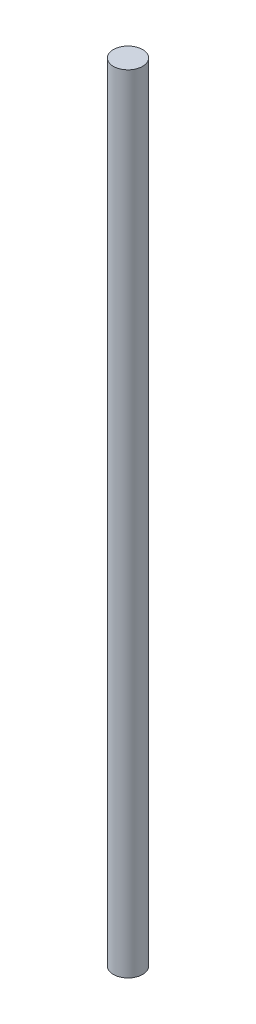
ISO-10303-21;
HEADER;
FILE_DESCRIPTION(('STEP AP214'),'2;1');
FILE_NAME('part.step','',(''),(''),'','','');
FILE_SCHEMA(('AUTOMOTIVE_DESIGN { 1 0 10303 214 1 1 1 1 }'));
ENDSEC;
DATA;
#1=APPLICATION_CONTEXT('core data for automotive mechanical design processes');
#2=APPLICATION_PROTOCOL_DEFINITION('international standard','automotive_design',2000,#1);
#3=PRODUCT_CONTEXT('',#1,'mechanical');
#4=PRODUCT('Part','Part','',(#3));
#5=PRODUCT_RELATED_PRODUCT_CATEGORY('part','',(#4));
#6=PRODUCT_DEFINITION_FORMATION('','',#4);
#7=PRODUCT_DEFINITION_CONTEXT('part definition',#1,'design');
#8=PRODUCT_DEFINITION('design','',#6,#7);
#9=PRODUCT_DEFINITION_SHAPE('','',#8);
#10=(LENGTH_UNIT() NAMED_UNIT(*) SI_UNIT(.MILLI.,.METRE.));
#11=(NAMED_UNIT(*) PLANE_ANGLE_UNIT() SI_UNIT($,.RADIAN.));
#12=(NAMED_UNIT(*) SI_UNIT($,.STERADIAN.) SOLID_ANGLE_UNIT());
#13=UNCERTAINTY_MEASURE_WITH_UNIT(LENGTH_MEASURE(1.E-05),#10,'distance_accuracy_value','');
#14=(GEOMETRIC_REPRESENTATION_CONTEXT(3) GLOBAL_UNCERTAINTY_ASSIGNED_CONTEXT((#13)) GLOBAL_UNIT_ASSIGNED_CONTEXT((#10,
#11,#12)) REPRESENTATION_CONTEXT('',''));
#15=CARTESIAN_POINT('',(0.,0.,0.));
#16=DIRECTION('',(0.,0.,1.));
#17=DIRECTION('',(1.,0.,0.));
#18=AXIS2_PLACEMENT_3D('',#15,#16,#17);
#19=CARTESIAN_POINT('',(0.,404.,0.));
#20=DIRECTION('',(0.,-1.,0.));
#21=DIRECTION('',(0.,0.,-1.));
#22=AXIS2_PLACEMENT_3D('',#19,#20,#21);
#23=CYLINDRICAL_SURFACE('',#22,7.5);
#24=CARTESIAN_POINT('',(0.,404.,0.));
#25=DIRECTION('',(0.,1.,0.));
#26=DIRECTION('',(0.,0.,1.));
#27=AXIS2_PLACEMENT_3D('',#24,#25,#26);
#28=CIRCLE('',#27,7.5);
#29=CARTESIAN_POINT('',(0.,404.,7.5));
#30=VERTEX_POINT('',#29);
#31=EDGE_CURVE('E10',#30,#30,#28,.T.);
#32=ORIENTED_EDGE('',*,*,#31,.F.);
#33=EDGE_LOOP('',(#32));
#34=FACE_BOUND('',#33,.T.);
#35=CARTESIAN_POINT('',(0.,0.,0.));
#36=DIRECTION('',(0.,1.,0.));
#37=DIRECTION('',(0.,0.,1.));
#38=AXIS2_PLACEMENT_3D('',#35,#36,#37);
#39=CIRCLE('',#38,7.5);
#40=CARTESIAN_POINT('',(0.,0.,7.5));
#41=VERTEX_POINT('',#40);
#42=EDGE_CURVE('E35',#41,#41,#39,.T.);
#43=ORIENTED_EDGE('',*,*,#42,.T.);
#44=EDGE_LOOP('',(#43));
#45=FACE_BOUND('',#44,.T.);
#46=ADVANCED_FACE('F32',(#34,#45),#23,.T.);
#47=CARTESIAN_POINT('',(0.,404.,0.));
#48=DIRECTION('',(0.,1.,0.));
#49=DIRECTION('',(0.,0.,1.));
#50=AXIS2_PLACEMENT_3D('',#47,#48,#49);
#51=PLANE('',#50);
#52=ORIENTED_EDGE('',*,*,#31,.T.);
#53=EDGE_LOOP('',(#52));
#54=FACE_BOUND('',#53,.T.);
#55=ADVANCED_FACE('F47',(#54),#51,.T.);
#56=CARTESIAN_POINT('',(0.,0.,0.));
#57=DIRECTION('',(0.,1.,0.));
#58=DIRECTION('',(0.,0.,1.));
#59=AXIS2_PLACEMENT_3D('',#56,#57,#58);
#60=PLANE('',#59);
#61=ORIENTED_EDGE('',*,*,#42,.F.);
#62=EDGE_LOOP('',(#61));
#63=FACE_BOUND('',#62,.T.);
#64=ADVANCED_FACE('F45',(#63),#60,.F.);
#65=CLOSED_SHELL('',(#46,#55,#64));
#66=MANIFOLD_SOLID_BREP('B2',#65);
#67=ADVANCED_BREP_SHAPE_REPRESENTATION('',(#18,#66),#14);
#68=SHAPE_DEFINITION_REPRESENTATION(#9,#67);
ENDSEC;
END-ISO-10303-21;
